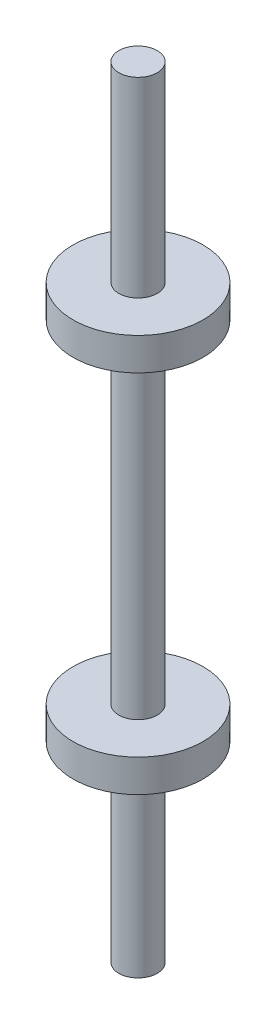
ISO-10303-21;
HEADER;
FILE_DESCRIPTION(('STEP AP214'),'2;1');
FILE_NAME('part.step','',(''),(''),'','','');
FILE_SCHEMA(('AUTOMOTIVE_DESIGN { 1 0 10303 214 1 1 1 1 }'));
ENDSEC;
DATA;
#1=APPLICATION_CONTEXT('core data for automotive mechanical design processes');
#2=APPLICATION_PROTOCOL_DEFINITION('international standard','automotive_design',2000,#1);
#3=PRODUCT_CONTEXT('',#1,'mechanical');
#4=PRODUCT('Part','Part','',(#3));
#5=PRODUCT_RELATED_PRODUCT_CATEGORY('part','',(#4));
#6=PRODUCT_DEFINITION_FORMATION('','',#4);
#7=PRODUCT_DEFINITION_CONTEXT('part definition',#1,'design');
#8=PRODUCT_DEFINITION('design','',#6,#7);
#9=PRODUCT_DEFINITION_SHAPE('','',#8);
#10=(LENGTH_UNIT() NAMED_UNIT(*) SI_UNIT(.MILLI.,.METRE.));
#11=(NAMED_UNIT(*) PLANE_ANGLE_UNIT() SI_UNIT($,.RADIAN.));
#12=(NAMED_UNIT(*) SI_UNIT($,.STERADIAN.) SOLID_ANGLE_UNIT());
#13=UNCERTAINTY_MEASURE_WITH_UNIT(LENGTH_MEASURE(1.E-05),#10,'distance_accuracy_value','');
#14=(GEOMETRIC_REPRESENTATION_CONTEXT(3) GLOBAL_UNCERTAINTY_ASSIGNED_CONTEXT((#13)) GLOBAL_UNIT_ASSIGNED_CONTEXT((#10,
#11,#12)) REPRESENTATION_CONTEXT('',''));
#15=CARTESIAN_POINT('',(0.,0.,0.));
#16=DIRECTION('',(0.,0.,1.));
#17=DIRECTION('',(1.,0.,0.));
#18=AXIS2_PLACEMENT_3D('',#15,#16,#17);
#19=CARTESIAN_POINT('',(0.,304.8,0.));
#20=DIRECTION('',(0.,-1.,0.));
#21=DIRECTION('',(0.,0.,-1.));
#22=AXIS2_PLACEMENT_3D('',#19,#20,#21);
#23=CYLINDRICAL_SURFACE('',#22,7.5);
#24=CARTESIAN_POINT('',(0.,230.1,0.));
#25=DIRECTION('',(0.,1.,0.));
#26=DIRECTION('',(0.,0.,1.));
#27=AXIS2_PLACEMENT_3D('',#24,#25,#26);
#28=CIRCLE('',#27,7.5);
#29=CARTESIAN_POINT('',(0.,230.1,-7.5));
#30=VERTEX_POINT('',#29);
#31=EDGE_CURVE('E44',#30,#30,#28,.T.);
#32=CARTESIAN_POINT('',(0.,304.8,0.));
#33=DIRECTION('',(0.,1.,0.));
#34=DIRECTION('',(0.,0.,1.));
#35=AXIS2_PLACEMENT_3D('',#32,#33,#34);
#36=CIRCLE('',#35,7.5);
#37=CARTESIAN_POINT('',(0.,304.8,-7.5));
#38=VERTEX_POINT('',#37);
#39=EDGE_CURVE('E10',#38,#38,#36,.T.);
#40=CARTESIAN_POINT('',(0.,230.1,-7.5));
#41=CARTESIAN_POINT('',(0.,230.878125,-7.5));
#42=CARTESIAN_POINT('',(0.,231.65625,-7.5));
#43=CARTESIAN_POINT('',(0.,233.2125,-7.5));
#44=CARTESIAN_POINT('',(0.,233.990625,-7.5));
#45=CARTESIAN_POINT('',(0.,235.546875,-7.5));
#46=CARTESIAN_POINT('',(0.,236.325,-7.5));
#47=CARTESIAN_POINT('',(0.,237.88125,-7.5));
#48=CARTESIAN_POINT('',(0.,238.659375,-7.5));
#49=CARTESIAN_POINT('',(0.,240.215625,-7.5));
#50=CARTESIAN_POINT('',(0.,240.99375,-7.5));
#51=CARTESIAN_POINT('',(0.,242.55,-7.5));
#52=CARTESIAN_POINT('',(0.,243.328125,-7.5));
#53=CARTESIAN_POINT('',(0.,244.884375,-7.5));
#54=CARTESIAN_POINT('',(0.,245.6625,-7.5));
#55=CARTESIAN_POINT('',(0.,247.21875,-7.5));
#56=CARTESIAN_POINT('',(0.,247.996875,-7.5));
#57=CARTESIAN_POINT('',(0.,249.553125,-7.5));
#58=CARTESIAN_POINT('',(0.,250.33125,-7.5));
#59=CARTESIAN_POINT('',(0.,251.8875,-7.5));
#60=CARTESIAN_POINT('',(0.,252.665625,-7.5));
#61=CARTESIAN_POINT('',(0.,254.221875,-7.5));
#62=CARTESIAN_POINT('',(0.,255.,-7.5));
#63=CARTESIAN_POINT('',(0.,256.55625,-7.5));
#64=CARTESIAN_POINT('',(0.,257.334375,-7.5));
#65=CARTESIAN_POINT('',(0.,258.890625,-7.5));
#66=CARTESIAN_POINT('',(0.,259.66875,-7.5));
#67=CARTESIAN_POINT('',(0.,261.225,-7.5));
#68=CARTESIAN_POINT('',(0.,262.003125,-7.5));
#69=CARTESIAN_POINT('',(0.,263.559375,-7.5));
#70=CARTESIAN_POINT('',(0.,264.3375,-7.5));
#71=CARTESIAN_POINT('',(0.,265.89375,-7.5));
#72=CARTESIAN_POINT('',(0.,266.671875,-7.5));
#73=CARTESIAN_POINT('',(0.,268.228125,-7.5));
#74=CARTESIAN_POINT('',(0.,269.00625,-7.5));
#75=CARTESIAN_POINT('',(0.,270.5625,-7.5));
#76=CARTESIAN_POINT('',(0.,271.340625,-7.5));
#77=CARTESIAN_POINT('',(0.,272.896875,-7.5));
#78=CARTESIAN_POINT('',(0.,273.675,-7.5));
#79=CARTESIAN_POINT('',(0.,275.23125,-7.5));
#80=CARTESIAN_POINT('',(0.,276.009375,-7.5));
#81=CARTESIAN_POINT('',(0.,277.565625,-7.5));
#82=CARTESIAN_POINT('',(0.,278.34375,-7.5));
#83=CARTESIAN_POINT('',(0.,279.9,-7.5));
#84=CARTESIAN_POINT('',(0.,280.678125,-7.5));
#85=CARTESIAN_POINT('',(0.,282.234375,-7.5));
#86=CARTESIAN_POINT('',(0.,283.0125,-7.5));
#87=CARTESIAN_POINT('',(0.,284.56875,-7.5));
#88=CARTESIAN_POINT('',(0.,285.346875,-7.5));
#89=CARTESIAN_POINT('',(0.,286.903125,-7.5));
#90=CARTESIAN_POINT('',(0.,287.68125,-7.5));
#91=CARTESIAN_POINT('',(0.,289.2375,-7.5));
#92=CARTESIAN_POINT('',(0.,290.015625,-7.5));
#93=CARTESIAN_POINT('',(0.,291.571875,-7.5));
#94=CARTESIAN_POINT('',(0.,292.35,-7.5));
#95=CARTESIAN_POINT('',(0.,293.90625,-7.5));
#96=CARTESIAN_POINT('',(0.,294.684375,-7.5));
#97=CARTESIAN_POINT('',(0.,296.240625,-7.5));
#98=CARTESIAN_POINT('',(0.,297.01875,-7.5));
#99=CARTESIAN_POINT('',(0.,298.575,-7.5));
#100=CARTESIAN_POINT('',(0.,299.353125,-7.5));
#101=CARTESIAN_POINT('',(0.,300.909375,-7.5));
#102=CARTESIAN_POINT('',(0.,301.6875,-7.5));
#103=CARTESIAN_POINT('',(0.,303.24375,-7.5));
#104=CARTESIAN_POINT('',(0.,304.021875,-7.5));
#105=CARTESIAN_POINT('',(0.,304.8,-7.5));
#106=B_SPLINE_CURVE_WITH_KNOTS('',3,(#40,#41,#42,#43,#44,#45,#46,#47,#48,#49,#50,#51,#52,#53,
#54,#55,#56,#57,#58,#59,#60,#61,#62,#63,#64,#65,#66,#67,#68,#69,#70,#71,#72,#73,#74,#75,#76,#77,
#78,#79,#80,#81,#82,#83,#84,#85,#86,#87,#88,#89,#90,#91,#92,#93,#94,#95,#96,#97,#98,#99,#100,
#101,#102,#103,#104,#105),.UNSPECIFIED.,.F.,.F.,(4,2,2,2,2,2,2,2,2,2,2,2,2,2,2,2,2,2,2,2,2,2,2,
2,2,2,2,2,2,2,2,2,4),(0.,2.334375,4.66875,7.003125,9.3375,11.671875,14.00625,16.340625,18.675,
21.009375,23.34375,25.678125,28.0125,30.346875,32.68125,35.015625,37.35,39.684375,42.01875,
44.353125,46.6875,49.021875,51.35625,53.690625,56.025,58.359375,60.69375,63.028125,65.3625,
67.696875,70.03125,72.3656250000001,74.7),.UNSPECIFIED.);
#107=EDGE_CURVE('BSEAM31',#30,#38,#106,.T.);
#108=ORIENTED_EDGE('',*,*,#31,.T.);
#109=ORIENTED_EDGE('',*,*,#39,.F.);
#110=ORIENTED_EDGE('',*,*,#107,.T.);
#111=ORIENTED_EDGE('',*,*,#107,.F.);
#112=EDGE_LOOP('',(#108,#110,#109,#111));
#113=FACE_BOUND('',#112,.T.);
#114=ADVANCED_FACE('F31',(#113),#23,.T.);
#115=CARTESIAN_POINT('',(0.,304.8,0.));
#116=DIRECTION('',(0.,1.,0.));
#117=DIRECTION('',(0.,0.,1.));
#118=AXIS2_PLACEMENT_3D('',#115,#116,#117);
#119=PLANE('',#118);
#120=ORIENTED_EDGE('',*,*,#39,.T.);
#121=EDGE_LOOP('',(#120));
#122=FACE_BOUND('',#121,.T.);
#123=ADVANCED_FACE('F79',(#122),#119,.T.);
#124=CARTESIAN_POINT('',(0.,230.1,0.));
#125=DIRECTION('',(0.,1.,0.));
#126=DIRECTION('',(0.,0.,1.));
#127=AXIS2_PLACEMENT_3D('',#124,#125,#126);
#128=PLANE('',#127);
#129=ORIENTED_EDGE('',*,*,#31,.F.);
#130=EDGE_LOOP('',(#129));
#131=FACE_BOUND('',#130,.T.);
#132=CARTESIAN_POINT('',(0.,230.1,0.));
#133=DIRECTION('',(0.,-1.,0.));
#134=DIRECTION('',(0.,0.,-1.));
#135=AXIS2_PLACEMENT_3D('',#132,#133,#134);
#136=CIRCLE('',#135,25.4);
#137=CARTESIAN_POINT('',(0.,230.1,-25.4));
#138=VERTEX_POINT('',#137);
#139=EDGE_CURVE('E47',#138,#138,#136,.T.);
#140=ORIENTED_EDGE('',*,*,#139,.F.);
#141=EDGE_LOOP('',(#140));
#142=FACE_BOUND('',#141,.T.);
#143=ADVANCED_FACE('F77',(#131,#142),#128,.T.);
#144=CARTESIAN_POINT('',(0.,217.4,0.));
#145=DIRECTION('',(0.,-1.,0.));
#146=DIRECTION('',(0.,0.,-1.));
#147=AXIS2_PLACEMENT_3D('',#144,#145,#146);
#148=CYLINDRICAL_SURFACE('',#147,25.4);
#149=ORIENTED_EDGE('',*,*,#139,.T.);
#150=EDGE_LOOP('',(#149));
#151=FACE_BOUND('',#150,.T.);
#152=CARTESIAN_POINT('',(0.,217.4,0.));
#153=DIRECTION('',(0.,-1.,0.));
#154=DIRECTION('',(0.,0.,-1.));
#155=AXIS2_PLACEMENT_3D('',#152,#153,#154);
#156=CIRCLE('',#155,25.4);
#157=CARTESIAN_POINT('',(0.,217.4,-25.4));
#158=VERTEX_POINT('',#157);
#159=EDGE_CURVE('E60',#158,#158,#156,.T.);
#160=ORIENTED_EDGE('',*,*,#159,.F.);
#161=EDGE_LOOP('',(#160));
#162=FACE_BOUND('',#161,.T.);
#163=ADVANCED_FACE('F74',(#151,#162),#148,.T.);
#164=CARTESIAN_POINT('',(0.,217.4,0.));
#165=DIRECTION('',(0.,-1.,0.));
#166=DIRECTION('',(0.,0.,-1.));
#167=AXIS2_PLACEMENT_3D('',#164,#165,#166);
#168=PLANE('',#167);
#169=CARTESIAN_POINT('',(0.,217.4,0.));
#170=DIRECTION('',(0.,-1.,0.));
#171=DIRECTION('',(0.,0.,-1.));
#172=AXIS2_PLACEMENT_3D('',#169,#170,#171);
#173=CIRCLE('',#172,7.5);
#174=CARTESIAN_POINT('',(0.,217.4,-7.5));
#175=VERTEX_POINT('',#174);
#176=EDGE_CURVE('E50',#175,#175,#173,.T.);
#177=ORIENTED_EDGE('',*,*,#176,.F.);
#178=EDGE_LOOP('',(#177));
#179=FACE_BOUND('',#178,.T.);
#180=ORIENTED_EDGE('',*,*,#159,.T.);
#181=EDGE_LOOP('',(#180));
#182=FACE_BOUND('',#181,.T.);
#183=ADVANCED_FACE('F86',(#179,#182),#168,.T.);
#184=CARTESIAN_POINT('',(0.,87.4,0.));
#185=DIRECTION('',(0.,1.,0.));
#186=DIRECTION('',(0.,0.,1.));
#187=AXIS2_PLACEMENT_3D('',#184,#185,#186);
#188=CIRCLE('',#187,7.5);
#189=CARTESIAN_POINT('',(0.,87.4,-7.5));
#190=VERTEX_POINT('',#189);
#191=EDGE_CURVE('E54',#190,#190,#188,.T.);
#192=CARTESIAN_POINT('',(0.,87.4,-7.5));
#193=CARTESIAN_POINT('',(0.,88.7541666666667,-7.5));
#194=CARTESIAN_POINT('',(0.,90.1083333333333,-7.5));
#195=CARTESIAN_POINT('',(0.,92.8166666666667,-7.5));
#196=CARTESIAN_POINT('',(0.,94.1708333333333,-7.5));
#197=CARTESIAN_POINT('',(0.,96.8791666666667,-7.5));
#198=CARTESIAN_POINT('',(0.,98.2333333333333,-7.5));
#199=CARTESIAN_POINT('',(0.,100.941666666667,-7.5));
#200=CARTESIAN_POINT('',(0.,102.295833333333,-7.5));
#201=CARTESIAN_POINT('',(0.,105.004166666667,-7.5));
#202=CARTESIAN_POINT('',(0.,106.358333333333,-7.5));
#203=CARTESIAN_POINT('',(0.,109.066666666667,-7.5));
#204=CARTESIAN_POINT('',(0.,110.420833333333,-7.5));
#205=CARTESIAN_POINT('',(0.,113.129166666667,-7.5));
#206=CARTESIAN_POINT('',(0.,114.483333333333,-7.5));
#207=CARTESIAN_POINT('',(0.,117.191666666667,-7.5));
#208=CARTESIAN_POINT('',(0.,118.545833333333,-7.5));
#209=CARTESIAN_POINT('',(0.,121.254166666667,-7.5));
#210=CARTESIAN_POINT('',(0.,122.608333333333,-7.5));
#211=CARTESIAN_POINT('',(0.,125.316666666667,-7.5));
#212=CARTESIAN_POINT('',(0.,126.670833333333,-7.5));
#213=CARTESIAN_POINT('',(0.,129.379166666667,-7.5));
#214=CARTESIAN_POINT('',(0.,130.733333333333,-7.5));
#215=CARTESIAN_POINT('',(0.,133.441666666667,-7.5));
#216=CARTESIAN_POINT('',(0.,134.795833333333,-7.5));
#217=CARTESIAN_POINT('',(0.,137.504166666667,-7.5));
#218=CARTESIAN_POINT('',(0.,138.858333333333,-7.5));
#219=CARTESIAN_POINT('',(0.,141.566666666667,-7.5));
#220=CARTESIAN_POINT('',(0.,142.920833333333,-7.5));
#221=CARTESIAN_POINT('',(0.,145.629166666667,-7.5));
#222=CARTESIAN_POINT('',(0.,146.983333333333,-7.5));
#223=CARTESIAN_POINT('',(0.,149.691666666667,-7.5));
#224=CARTESIAN_POINT('',(0.,151.045833333333,-7.5));
#225=CARTESIAN_POINT('',(0.,153.754166666667,-7.5));
#226=CARTESIAN_POINT('',(0.,155.108333333333,-7.5));
#227=CARTESIAN_POINT('',(0.,157.816666666667,-7.5));
#228=CARTESIAN_POINT('',(0.,159.170833333333,-7.5));
#229=CARTESIAN_POINT('',(0.,161.879166666667,-7.5));
#230=CARTESIAN_POINT('',(0.,163.233333333333,-7.5));
#231=CARTESIAN_POINT('',(0.,165.941666666667,-7.5));
#232=CARTESIAN_POINT('',(0.,167.295833333333,-7.5));
#233=CARTESIAN_POINT('',(0.,170.004166666667,-7.5));
#234=CARTESIAN_POINT('',(0.,171.358333333333,-7.5));
#235=CARTESIAN_POINT('',(0.,174.066666666667,-7.5));
#236=CARTESIAN_POINT('',(0.,175.420833333333,-7.5));
#237=CARTESIAN_POINT('',(0.,178.129166666667,-7.5));
#238=CARTESIAN_POINT('',(0.,179.483333333333,-7.5));
#239=CARTESIAN_POINT('',(0.,182.191666666667,-7.5));
#240=CARTESIAN_POINT('',(0.,183.545833333333,-7.5));
#241=CARTESIAN_POINT('',(0.,186.254166666667,-7.5));
#242=CARTESIAN_POINT('',(0.,187.608333333333,-7.5));
#243=CARTESIAN_POINT('',(0.,190.316666666667,-7.5));
#244=CARTESIAN_POINT('',(0.,191.670833333333,-7.5));
#245=CARTESIAN_POINT('',(0.,194.379166666667,-7.5));
#246=CARTESIAN_POINT('',(0.,195.733333333333,-7.5));
#247=CARTESIAN_POINT('',(0.,198.441666666667,-7.5));
#248=CARTESIAN_POINT('',(0.,199.795833333333,-7.5));
#249=CARTESIAN_POINT('',(0.,202.504166666667,-7.5));
#250=CARTESIAN_POINT('',(0.,203.858333333333,-7.5));
#251=CARTESIAN_POINT('',(0.,206.566666666667,-7.5));
#252=CARTESIAN_POINT('',(0.,207.920833333333,-7.5));
#253=CARTESIAN_POINT('',(0.,210.629166666667,-7.5));
#254=CARTESIAN_POINT('',(0.,211.983333333333,-7.5));
#255=CARTESIAN_POINT('',(0.,214.691666666667,-7.5));
#256=CARTESIAN_POINT('',(0.,216.045833333333,-7.5));
#257=CARTESIAN_POINT('',(0.,217.4,-7.5));
#258=B_SPLINE_CURVE_WITH_KNOTS('',3,(#192,#193,#194,#195,#196,#197,#198,#199,#200,#201,#202,
#203,#204,#205,#206,#207,#208,#209,#210,#211,#212,#213,#214,#215,#216,#217,#218,#219,#220,#221,
#222,#223,#224,#225,#226,#227,#228,#229,#230,#231,#232,#233,#234,#235,#236,#237,#238,#239,#240,
#241,#242,#243,#244,#245,#246,#247,#248,#249,#250,#251,#252,#253,#254,#255,#256,#257),
.UNSPECIFIED.,.F.,.F.,(4,2,2,2,2,2,2,2,2,2,2,2,2,2,2,2,2,2,2,2,2,2,2,2,2,2,2,2,2,2,2,2,4),(0.,
4.0625,8.12499999999999,12.1875,16.25,20.3125,24.375,28.4375,32.5,36.5625,40.625,44.6875,48.75,
52.8125,56.875,60.9375,65.,69.0625,73.1250000000001,77.1875,81.25,85.3125,89.375,93.4375,97.5,
101.5625,105.625,109.6875,113.75,117.8125,121.875,125.9375,130.),.UNSPECIFIED.);
#259=EDGE_CURVE('BSEAM33',#190,#175,#258,.T.);
#260=ORIENTED_EDGE('',*,*,#191,.T.);
#261=ORIENTED_EDGE('',*,*,#176,.T.);
#262=ORIENTED_EDGE('',*,*,#259,.T.);
#263=ORIENTED_EDGE('',*,*,#259,.F.);
#264=EDGE_LOOP('',(#260,#262,#261,#263));
#265=FACE_BOUND('',#264,.T.);
#266=ADVANCED_FACE('F33',(#265),#23,.T.);
#267=CARTESIAN_POINT('',(0.,74.7,0.));
#268=DIRECTION('',(0.,-1.,0.));
#269=DIRECTION('',(0.,0.,-1.));
#270=AXIS2_PLACEMENT_3D('',#267,#268,#269);
#271=PLANE('',#270);
#272=CARTESIAN_POINT('',(0.,74.7,0.));
#273=DIRECTION('',(0.,-1.,0.));
#274=DIRECTION('',(0.,0.,-1.));
#275=AXIS2_PLACEMENT_3D('',#272,#273,#274);
#276=CIRCLE('',#275,7.5);
#277=CARTESIAN_POINT('',(0.,74.7000000000001,-7.5));
#278=VERTEX_POINT('',#277);
#279=EDGE_CURVE('E35',#278,#278,#276,.T.);
#280=ORIENTED_EDGE('',*,*,#279,.F.);
#281=EDGE_LOOP('',(#280));
#282=FACE_BOUND('',#281,.T.);
#283=CARTESIAN_POINT('',(0.,74.7,0.));
#284=DIRECTION('',(0.,-1.,0.));
#285=DIRECTION('',(0.,0.,-1.));
#286=AXIS2_PLACEMENT_3D('',#283,#284,#285);
#287=CIRCLE('',#286,25.4);
#288=CARTESIAN_POINT('',(0.,74.7,-25.4));
#289=VERTEX_POINT('',#288);
#290=EDGE_CURVE('E56',#289,#289,#287,.T.);
#291=ORIENTED_EDGE('',*,*,#290,.T.);
#292=EDGE_LOOP('',(#291));
#293=FACE_BOUND('',#292,.T.);
#294=ADVANCED_FACE('F99',(#282,#293),#271,.T.);
#295=CARTESIAN_POINT('',(0.,217.4,0.));
#296=DIRECTION('',(0.,-1.,0.));
#297=DIRECTION('',(0.,0.,-1.));
#298=AXIS2_PLACEMENT_3D('',#295,#296,#297);
#299=CYLINDRICAL_SURFACE('',#298,25.4);
#300=CARTESIAN_POINT('',(0.,87.4,0.));
#301=DIRECTION('',(0.,-1.,0.));
#302=DIRECTION('',(0.,0.,-1.));
#303=AXIS2_PLACEMENT_3D('',#300,#301,#302);
#304=CIRCLE('',#303,25.4);
#305=CARTESIAN_POINT('',(0.,87.4,-25.4));
#306=VERTEX_POINT('',#305);
#307=EDGE_CURVE('E62',#306,#306,#304,.T.);
#308=ORIENTED_EDGE('',*,*,#307,.T.);
#309=EDGE_LOOP('',(#308));
#310=FACE_BOUND('',#309,.T.);
#311=ORIENTED_EDGE('',*,*,#290,.F.);
#312=EDGE_LOOP('',(#311));
#313=FACE_BOUND('',#312,.T.);
#314=ADVANCED_FACE('F114',(#310,#313),#299,.T.);
#315=CARTESIAN_POINT('',(0.,87.4,0.));
#316=DIRECTION('',(0.,1.,0.));
#317=DIRECTION('',(0.,0.,1.));
#318=AXIS2_PLACEMENT_3D('',#315,#316,#317);
#319=PLANE('',#318);
#320=ORIENTED_EDGE('',*,*,#191,.F.);
#321=EDGE_LOOP('',(#320));
#322=FACE_BOUND('',#321,.T.);
#323=ORIENTED_EDGE('',*,*,#307,.F.);
#324=EDGE_LOOP('',(#323));
#325=FACE_BOUND('',#324,.T.);
#326=ADVANCED_FACE('F107',(#322,#325),#319,.T.);
#327=CARTESIAN_POINT('',(0.,0.,0.));
#328=DIRECTION('',(0.,1.,0.));
#329=DIRECTION('',(0.,0.,1.));
#330=AXIS2_PLACEMENT_3D('',#327,#328,#329);
#331=PLANE('',#330);
#332=CARTESIAN_POINT('',(0.,0.,0.));
#333=DIRECTION('',(0.,1.,0.));
#334=DIRECTION('',(0.,0.,1.));
#335=AXIS2_PLACEMENT_3D('',#332,#333,#334);
#336=CIRCLE('',#335,7.5);
#337=CARTESIAN_POINT('',(0.,0.,-7.5));
#338=VERTEX_POINT('',#337);
#339=EDGE_CURVE('E39',#338,#338,#336,.T.);
#340=ORIENTED_EDGE('',*,*,#339,.F.);
#341=EDGE_LOOP('',(#340));
#342=FACE_BOUND('',#341,.T.);
#343=ADVANCED_FACE('F101',(#342),#331,.F.);
#344=CARTESIAN_POINT('',(0.,74.7000000000001,-7.5));
#345=CARTESIAN_POINT('',(0.,73.9218750000001,-7.5));
#346=CARTESIAN_POINT('',(0.,73.1437500000001,-7.5));
#347=CARTESIAN_POINT('',(0.,71.5875000000001,-7.5));
#348=CARTESIAN_POINT('',(0.,70.8093750000001,-7.5));
#349=CARTESIAN_POINT('',(0.,69.2531250000001,-7.5));
#350=CARTESIAN_POINT('',(0.,68.4750000000001,-7.5));
#351=CARTESIAN_POINT('',(0.,66.9187500000001,-7.5));
#352=CARTESIAN_POINT('',(0.,66.1406250000001,-7.5));
#353=CARTESIAN_POINT('',(0.,64.5843750000001,-7.5));
#354=CARTESIAN_POINT('',(0.,63.80625,-7.5));
#355=CARTESIAN_POINT('',(0.,62.25,-7.5));
#356=CARTESIAN_POINT('',(0.,61.471875,-7.5));
#357=CARTESIAN_POINT('',(0.,59.915625,-7.5));
#358=CARTESIAN_POINT('',(0.,59.1375,-7.5));
#359=CARTESIAN_POINT('',(0.,57.58125,-7.5));
#360=CARTESIAN_POINT('',(0.,56.803125,-7.5));
#361=CARTESIAN_POINT('',(0.,55.2468750000001,-7.5));
#362=CARTESIAN_POINT('',(0.,54.46875,-7.5));
#363=CARTESIAN_POINT('',(0.,52.9125000000001,-7.5));
#364=CARTESIAN_POINT('',(0.,52.134375,-7.5));
#365=CARTESIAN_POINT('',(0.,50.578125,-7.5));
#366=CARTESIAN_POINT('',(0.,49.8,-7.5));
#367=CARTESIAN_POINT('',(0.,48.24375,-7.5));
#368=CARTESIAN_POINT('',(0.,47.465625,-7.5));
#369=CARTESIAN_POINT('',(0.,45.9093750000001,-7.5));
#370=CARTESIAN_POINT('',(0.,45.13125,-7.5));
#371=CARTESIAN_POINT('',(0.,43.5750000000001,-7.5));
#372=CARTESIAN_POINT('',(0.,42.796875,-7.5));
#373=CARTESIAN_POINT('',(0.,41.2406250000001,-7.5));
#374=CARTESIAN_POINT('',(0.,40.4625,-7.5));
#375=CARTESIAN_POINT('',(0.,38.90625,-7.5));
#376=CARTESIAN_POINT('',(0.,38.128125,-7.5));
#377=CARTESIAN_POINT('',(0.,36.5718750000001,-7.5));
#378=CARTESIAN_POINT('',(0.,35.79375,-7.5));
#379=CARTESIAN_POINT('',(0.,34.2375000000001,-7.5));
#380=CARTESIAN_POINT('',(0.,33.4593750000001,-7.5));
#381=CARTESIAN_POINT('',(0.,31.9031250000001,-7.5));
#382=CARTESIAN_POINT('',(0.,31.1250000000001,-7.5));
#383=CARTESIAN_POINT('',(0.,29.5687500000001,-7.5));
#384=CARTESIAN_POINT('',(0.,28.7906250000001,-7.5));
#385=CARTESIAN_POINT('',(0.,27.234375,-7.5));
#386=CARTESIAN_POINT('',(0.,26.4562500000001,-7.5));
#387=CARTESIAN_POINT('',(0.,24.9000000000001,-7.5));
#388=CARTESIAN_POINT('',(0.,24.1218750000001,-7.5));
#389=CARTESIAN_POINT('',(0.,22.565625,-7.5));
#390=CARTESIAN_POINT('',(0.,21.7875,-7.5));
#391=CARTESIAN_POINT('',(0.,20.23125,-7.5));
#392=CARTESIAN_POINT('',(0.,19.453125,-7.5));
#393=CARTESIAN_POINT('',(0.,17.896875,-7.5));
#394=CARTESIAN_POINT('',(0.,17.11875,-7.5));
#395=CARTESIAN_POINT('',(0.,15.5625,-7.5));
#396=CARTESIAN_POINT('',(0.,14.784375,-7.5));
#397=CARTESIAN_POINT('',(0.,13.228125,-7.5));
#398=CARTESIAN_POINT('',(0.,12.45,-7.5));
#399=CARTESIAN_POINT('',(0.,10.89375,-7.5));
#400=CARTESIAN_POINT('',(0.,10.115625,-7.5));
#401=CARTESIAN_POINT('',(0.,8.559375,-7.5));
#402=CARTESIAN_POINT('',(0.,7.78125,-7.5));
#403=CARTESIAN_POINT('',(0.,6.225,-7.5));
#404=CARTESIAN_POINT('',(0.,5.446875,-7.5));
#405=CARTESIAN_POINT('',(0.,3.890625,-7.5));
#406=CARTESIAN_POINT('',(0.,3.1125,-7.5));
#407=CARTESIAN_POINT('',(0.,1.55625,-7.5));
#408=CARTESIAN_POINT('',(0.,0.778125000000001,-7.5));
#409=CARTESIAN_POINT('',(0.,0.,-7.5));
#410=B_SPLINE_CURVE_WITH_KNOTS('',3,(#344,#345,#346,#347,#348,#349,#350,#351,#352,#353,#354,
#355,#356,#357,#358,#359,#360,#361,#362,#363,#364,#365,#366,#367,#368,#369,#370,#371,#372,#373,
#374,#375,#376,#377,#378,#379,#380,#381,#382,#383,#384,#385,#386,#387,#388,#389,#390,#391,#392,
#393,#394,#395,#396,#397,#398,#399,#400,#401,#402,#403,#404,#405,#406,#407,#408,#409),
.UNSPECIFIED.,.F.,.F.,(4,2,2,2,2,2,2,2,2,2,2,2,2,2,2,2,2,2,2,2,2,2,2,2,2,2,2,2,2,2,2,2,4),(0.,
2.334375,4.66875,7.003125,9.3375,11.671875,14.00625,16.340625,18.675,21.009375,23.34375,
25.678125,28.0125,30.346875,32.68125,35.015625,37.35,39.684375,42.01875,44.353125,46.6875,
49.021875,51.35625,53.6906250000001,56.0250000000001,58.3593750000001,60.6937500000001,
63.0281250000001,65.3625000000001,67.6968750000001,70.0312500000001,72.3656250000001,
74.7000000000001),.UNSPECIFIED.);
#411=EDGE_CURVE('BSEAM93',#278,#338,#410,.T.);
#412=ORIENTED_EDGE('',*,*,#279,.T.);
#413=ORIENTED_EDGE('',*,*,#339,.T.);
#414=ORIENTED_EDGE('',*,*,#411,.T.);
#415=ORIENTED_EDGE('',*,*,#411,.F.);
#416=EDGE_LOOP('',(#412,#414,#413,#415));
#417=FACE_BOUND('',#416,.T.);
#418=ADVANCED_FACE('F93',(#417),#23,.T.);
#419=CLOSED_SHELL('',(#114,#123,#143,#163,#183,#266,#294,#314,#326,#343,#418));
#420=MANIFOLD_SOLID_BREP('B2',#419);
#421=ADVANCED_BREP_SHAPE_REPRESENTATION('',(#18,#420),#14);
#422=SHAPE_DEFINITION_REPRESENTATION(#9,#421);
ENDSEC;
END-ISO-10303-21;
